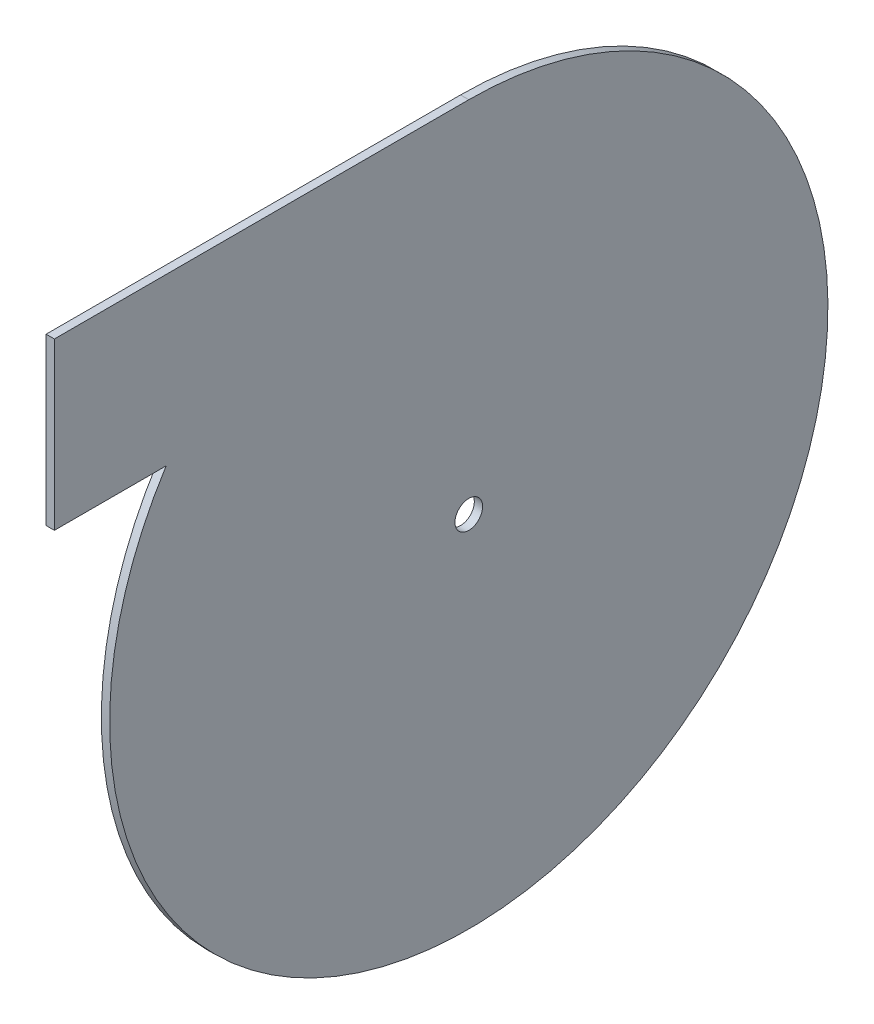
ISO-10303-21;
HEADER;
FILE_DESCRIPTION(('STEP AP214'),'2;1');
FILE_NAME('part.step','',(''),(''),'','','');
FILE_SCHEMA(('AUTOMOTIVE_DESIGN { 1 0 10303 214 1 1 1 1 }'));
ENDSEC;
DATA;
#1=APPLICATION_CONTEXT('core data for automotive mechanical design processes');
#2=APPLICATION_PROTOCOL_DEFINITION('international standard','automotive_design',2000,#1);
#3=PRODUCT_CONTEXT('',#1,'mechanical');
#4=PRODUCT('Part','Part','',(#3));
#5=PRODUCT_RELATED_PRODUCT_CATEGORY('part','',(#4));
#6=PRODUCT_DEFINITION_FORMATION('','',#4);
#7=PRODUCT_DEFINITION_CONTEXT('part definition',#1,'design');
#8=PRODUCT_DEFINITION('design','',#6,#7);
#9=PRODUCT_DEFINITION_SHAPE('','',#8);
#10=(LENGTH_UNIT() NAMED_UNIT(*) SI_UNIT(.MILLI.,.METRE.));
#11=(NAMED_UNIT(*) PLANE_ANGLE_UNIT() SI_UNIT($,.RADIAN.));
#12=(NAMED_UNIT(*) SI_UNIT($,.STERADIAN.) SOLID_ANGLE_UNIT());
#13=UNCERTAINTY_MEASURE_WITH_UNIT(LENGTH_MEASURE(1.E-05),#10,'distance_accuracy_value','');
#14=(GEOMETRIC_REPRESENTATION_CONTEXT(3) GLOBAL_UNCERTAINTY_ASSIGNED_CONTEXT((#13)) GLOBAL_UNIT_ASSIGNED_CONTEXT((#10,
#11,#12)) REPRESENTATION_CONTEXT('',''));
#15=CARTESIAN_POINT('',(0.,0.,0.));
#16=DIRECTION('',(0.,0.,1.));
#17=DIRECTION('',(1.,0.,0.));
#18=AXIS2_PLACEMENT_3D('',#15,#16,#17);
#19=CARTESIAN_POINT('',(3.,0.,0.));
#20=DIRECTION('',(1.,0.,0.));
#21=DIRECTION('',(0.,0.,-1.));
#22=AXIS2_PLACEMENT_3D('',#19,#20,#21);
#23=PLANE('',#22);
#24=CARTESIAN_POINT('',(3.,0.,0.));
#25=DIRECTION('',(1.,0.,0.));
#26=DIRECTION('',(0.,0.,-1.));
#27=AXIS2_PLACEMENT_3D('',#24,#25,#26);
#28=CIRCLE('',#27,130.);
#29=CARTESIAN_POINT('',(3.,70.,109.544511501033));
#30=VERTEX_POINT('',#29);
#31=CARTESIAN_POINT('',(3.,130.,0.));
#32=VERTEX_POINT('',#31);
#33=EDGE_CURVE('E98',#30,#32,#28,.T.);
#34=ORIENTED_EDGE('',*,*,#33,.T.);
#35=DIRECTION('',(0.,0.,1.));
#36=VECTOR('',#35,1.);
#37=CARTESIAN_POINT('',(3.,130.,0.));
#38=LINE('',#37,#36);
#39=CARTESIAN_POINT('',(3.,130.,150.));
#40=VERTEX_POINT('',#39);
#41=EDGE_CURVE('E93',#32,#40,#38,.T.);
#42=ORIENTED_EDGE('',*,*,#41,.T.);
#43=DIRECTION('',(0.,-1.,0.));
#44=VECTOR('',#43,1.);
#45=CARTESIAN_POINT('',(3.,130.,150.));
#46=LINE('',#45,#44);
#47=CARTESIAN_POINT('',(3.,70.,150.));
#48=VERTEX_POINT('',#47);
#49=EDGE_CURVE('E96',#40,#48,#46,.T.);
#50=ORIENTED_EDGE('',*,*,#49,.T.);
#51=DIRECTION('',(0.,0.,-1.));
#52=VECTOR('',#51,1.);
#53=CARTESIAN_POINT('',(3.,70.,150.));
#54=LINE('',#53,#52);
#55=EDGE_CURVE('E63',#48,#30,#54,.T.);
#56=ORIENTED_EDGE('',*,*,#55,.T.);
#57=EDGE_LOOP('',(#34,#42,#50,#56));
#58=FACE_BOUND('',#57,.T.);
#59=CARTESIAN_POINT('',(3.,0.,0.));
#60=DIRECTION('',(1.,0.,0.));
#61=DIRECTION('',(0.,0.,-1.));
#62=AXIS2_PLACEMENT_3D('',#59,#60,#61);
#63=CIRCLE('',#62,5.);
#64=CARTESIAN_POINT('',(3.,0.,-5.));
#65=VERTEX_POINT('',#64);
#66=EDGE_CURVE('E118',#65,#65,#63,.T.);
#67=ORIENTED_EDGE('',*,*,#66,.F.);
#68=EDGE_LOOP('',(#67));
#69=FACE_BOUND('',#68,.T.);
#70=ADVANCED_FACE('F45',(#58,#69),#23,.T.);
#71=CARTESIAN_POINT('',(0.,0.,0.));
#72=DIRECTION('',(1.,0.,0.));
#73=DIRECTION('',(0.,0.,-1.));
#74=AXIS2_PLACEMENT_3D('',#71,#72,#73);
#75=PLANE('',#74);
#76=CARTESIAN_POINT('',(0.,0.,0.));
#77=DIRECTION('',(1.,0.,0.));
#78=DIRECTION('',(0.,0.,-1.));
#79=AXIS2_PLACEMENT_3D('',#76,#77,#78);
#80=CIRCLE('',#79,130.);
#81=CARTESIAN_POINT('',(0.,70.,109.544511501033));
#82=VERTEX_POINT('',#81);
#83=CARTESIAN_POINT('',(0.,130.,0.));
#84=VERTEX_POINT('',#83);
#85=EDGE_CURVE('E114',#82,#84,#80,.T.);
#86=ORIENTED_EDGE('',*,*,#85,.F.);
#87=DIRECTION('',(0.,0.,-1.));
#88=VECTOR('',#87,1.);
#89=CARTESIAN_POINT('',(0.,70.,150.));
#90=LINE('',#89,#88);
#91=CARTESIAN_POINT('',(0.,70.,150.));
#92=VERTEX_POINT('',#91);
#93=EDGE_CURVE('E86',#92,#82,#90,.T.);
#94=ORIENTED_EDGE('',*,*,#93,.F.);
#95=DIRECTION('',(0.,-1.,0.));
#96=VECTOR('',#95,1.);
#97=CARTESIAN_POINT('',(0.,130.,150.));
#98=LINE('',#97,#96);
#99=CARTESIAN_POINT('',(0.,130.,150.));
#100=VERTEX_POINT('',#99);
#101=EDGE_CURVE('E80',#100,#92,#98,.T.);
#102=ORIENTED_EDGE('',*,*,#101,.F.);
#103=DIRECTION('',(0.,0.,1.));
#104=VECTOR('',#103,1.);
#105=CARTESIAN_POINT('',(0.,130.,0.));
#106=LINE('',#105,#104);
#107=EDGE_CURVE('E103',#84,#100,#106,.T.);
#108=ORIENTED_EDGE('',*,*,#107,.F.);
#109=EDGE_LOOP('',(#86,#94,#102,#108));
#110=FACE_BOUND('',#109,.T.);
#111=CARTESIAN_POINT('',(0.,0.,0.));
#112=DIRECTION('',(1.,0.,0.));
#113=DIRECTION('',(0.,0.,-1.));
#114=AXIS2_PLACEMENT_3D('',#111,#112,#113);
#115=CIRCLE('',#114,5.);
#116=CARTESIAN_POINT('',(0.,0.,-5.));
#117=VERTEX_POINT('',#116);
#118=EDGE_CURVE('E136',#117,#117,#115,.T.);
#119=ORIENTED_EDGE('',*,*,#118,.T.);
#120=EDGE_LOOP('',(#119));
#121=FACE_BOUND('',#120,.T.);
#122=ADVANCED_FACE('F131',(#110,#121),#75,.F.);
#123=CARTESIAN_POINT('',(3.,0.,0.));
#124=DIRECTION('',(-1.,0.,0.));
#125=DIRECTION('',(0.,0.,1.));
#126=AXIS2_PLACEMENT_3D('',#123,#124,#125);
#127=CYLINDRICAL_SURFACE('',#126,130.);
#128=ORIENTED_EDGE('',*,*,#85,.T.);
#129=DIRECTION('',(-1.,0.,0.));
#130=VECTOR('',#129,1.);
#131=CARTESIAN_POINT('',(3.,130.,0.));
#132=LINE('',#131,#130);
#133=EDGE_CURVE('E11',#32,#84,#132,.T.);
#134=ORIENTED_EDGE('',*,*,#133,.F.);
#135=ORIENTED_EDGE('',*,*,#33,.F.);
#136=DIRECTION('',(-1.,0.,0.));
#137=VECTOR('',#136,1.);
#138=CARTESIAN_POINT('',(3.,70.,109.544511501033));
#139=LINE('',#138,#137);
#140=EDGE_CURVE('E110',#30,#82,#139,.T.);
#141=ORIENTED_EDGE('',*,*,#140,.T.);
#142=EDGE_LOOP('',(#128,#134,#135,#141));
#143=FACE_BOUND('',#142,.T.);
#144=ADVANCED_FACE('F47',(#143),#127,.T.);
#145=CARTESIAN_POINT('',(3.,130.,0.));
#146=DIRECTION('',(0.,-1.,0.));
#147=DIRECTION('',(0.,0.,-1.));
#148=AXIS2_PLACEMENT_3D('',#145,#146,#147);
#149=PLANE('',#148);
#150=ORIENTED_EDGE('',*,*,#107,.T.);
#151=DIRECTION('',(-1.,0.,0.));
#152=VECTOR('',#151,1.);
#153=CARTESIAN_POINT('',(3.,130.,150.));
#154=LINE('',#153,#152);
#155=EDGE_CURVE('E55',#40,#100,#154,.T.);
#156=ORIENTED_EDGE('',*,*,#155,.F.);
#157=ORIENTED_EDGE('',*,*,#41,.F.);
#158=ORIENTED_EDGE('',*,*,#133,.T.);
#159=EDGE_LOOP('',(#150,#156,#157,#158));
#160=FACE_BOUND('',#159,.T.);
#161=ADVANCED_FACE('F102',(#160),#149,.F.);
#162=CARTESIAN_POINT('',(3.,130.,150.));
#163=DIRECTION('',(0.,0.,-1.));
#164=DIRECTION('',(-1.,0.,0.));
#165=AXIS2_PLACEMENT_3D('',#162,#163,#164);
#166=PLANE('',#165);
#167=ORIENTED_EDGE('',*,*,#101,.T.);
#168=DIRECTION('',(-1.,0.,0.));
#169=VECTOR('',#168,1.);
#170=CARTESIAN_POINT('',(3.,70.,150.));
#171=LINE('',#170,#169);
#172=EDGE_CURVE('E105',#48,#92,#171,.T.);
#173=ORIENTED_EDGE('',*,*,#172,.F.);
#174=ORIENTED_EDGE('',*,*,#49,.F.);
#175=ORIENTED_EDGE('',*,*,#155,.T.);
#176=EDGE_LOOP('',(#167,#173,#174,#175));
#177=FACE_BOUND('',#176,.T.);
#178=ADVANCED_FACE('F106',(#177),#166,.F.);
#179=CARTESIAN_POINT('',(3.,70.,150.));
#180=DIRECTION('',(0.,1.,0.));
#181=DIRECTION('',(0.,0.,1.));
#182=AXIS2_PLACEMENT_3D('',#179,#180,#181);
#183=PLANE('',#182);
#184=ORIENTED_EDGE('',*,*,#93,.T.);
#185=ORIENTED_EDGE('',*,*,#140,.F.);
#186=ORIENTED_EDGE('',*,*,#55,.F.);
#187=ORIENTED_EDGE('',*,*,#172,.T.);
#188=EDGE_LOOP('',(#184,#185,#186,#187));
#189=FACE_BOUND('',#188,.T.);
#190=ADVANCED_FACE('F128',(#189),#183,.F.);
#191=CARTESIAN_POINT('',(3.,0.,0.));
#192=DIRECTION('',(-1.,0.,0.));
#193=DIRECTION('',(0.,0.,1.));
#194=AXIS2_PLACEMENT_3D('',#191,#192,#193);
#195=CYLINDRICAL_SURFACE('',#194,5.);
#196=ORIENTED_EDGE('',*,*,#66,.T.);
#197=EDGE_LOOP('',(#196));
#198=FACE_BOUND('',#197,.T.);
#199=ORIENTED_EDGE('',*,*,#118,.F.);
#200=EDGE_LOOP('',(#199));
#201=FACE_BOUND('',#200,.T.);
#202=ADVANCED_FACE('F144',(#198,#201),#195,.F.);
#203=CLOSED_SHELL('',(#70,#122,#144,#161,#178,#190,#202));
#204=MANIFOLD_SOLID_BREP('B2',#203);
#205=ADVANCED_BREP_SHAPE_REPRESENTATION('',(#18,#204),#14);
#206=SHAPE_DEFINITION_REPRESENTATION(#9,#205);
ENDSEC;
END-ISO-10303-21;
